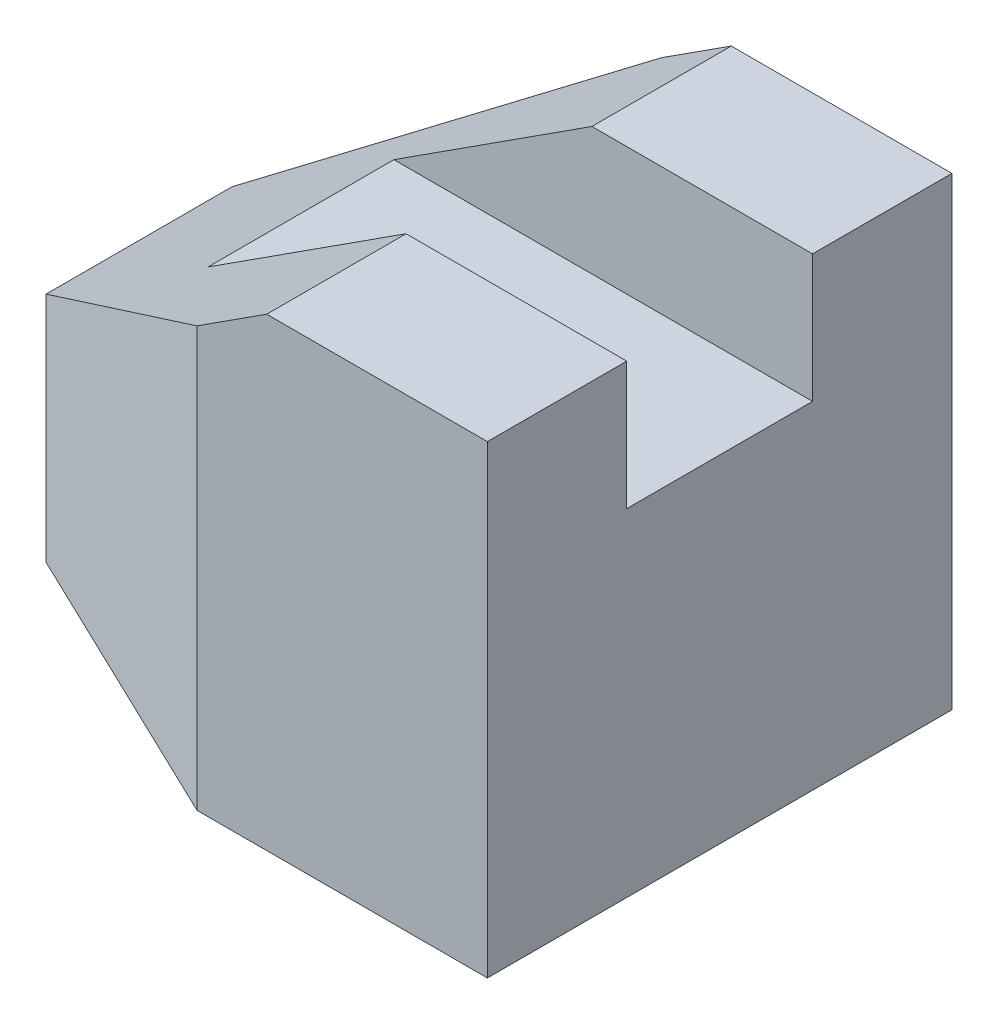
ISO-10303-21;
HEADER;
FILE_DESCRIPTION(('STEP AP214'),'2;1');
FILE_NAME('part.step','',(''),(''),'','','');
FILE_SCHEMA(('AUTOMOTIVE_DESIGN { 1 0 10303 214 1 1 1 1 }'));
ENDSEC;
DATA;
#1=APPLICATION_CONTEXT('core data for automotive mechanical design processes');
#2=APPLICATION_PROTOCOL_DEFINITION('international standard','automotive_design',2000,#1);
#3=PRODUCT_CONTEXT('',#1,'mechanical');
#4=PRODUCT('Part','Part','',(#3));
#5=PRODUCT_RELATED_PRODUCT_CATEGORY('part','',(#4));
#6=PRODUCT_DEFINITION_FORMATION('','',#4);
#7=PRODUCT_DEFINITION_CONTEXT('part definition',#1,'design');
#8=PRODUCT_DEFINITION('design','',#6,#7);
#9=PRODUCT_DEFINITION_SHAPE('','',#8);
#10=(LENGTH_UNIT() NAMED_UNIT(*) SI_UNIT(.MILLI.,.METRE.));
#11=(NAMED_UNIT(*) PLANE_ANGLE_UNIT() SI_UNIT($,.RADIAN.));
#12=(NAMED_UNIT(*) SI_UNIT($,.STERADIAN.) SOLID_ANGLE_UNIT());
#13=UNCERTAINTY_MEASURE_WITH_UNIT(LENGTH_MEASURE(1.E-05),#10,'distance_accuracy_value','');
#14=(GEOMETRIC_REPRESENTATION_CONTEXT(3) GLOBAL_UNCERTAINTY_ASSIGNED_CONTEXT((#13)) GLOBAL_UNIT_ASSIGNED_CONTEXT((#10,
#11,#12)) REPRESENTATION_CONTEXT('',''));
#15=CARTESIAN_POINT('',(0.,0.,0.));
#16=DIRECTION('',(0.,0.,1.));
#17=DIRECTION('',(1.,0.,0.));
#18=AXIS2_PLACEMENT_3D('',#15,#16,#17);
#19=CARTESIAN_POINT('',(0.,80.,0.));
#20=DIRECTION('',(0.,-1.,0.));
#21=DIRECTION('',(0.,0.,-1.));
#22=AXIS2_PLACEMENT_3D('',#19,#20,#21);
#23=PLANE('',#22);
#24=DIRECTION('',(0.,0.,1.));
#25=VECTOR('',#24,1.);
#26=CARTESIAN_POINT('',(62.,80.,0.));
#27=LINE('',#26,#25);
#28=CARTESIAN_POINT('',(62.,80.,0.));
#29=VERTEX_POINT('',#28);
#30=CARTESIAN_POINT('',(62.,80.,24.));
#31=VERTEX_POINT('',#30);
#32=EDGE_CURVE('E377',#29,#31,#27,.T.);
#33=ORIENTED_EDGE('',*,*,#32,.T.);
#34=DIRECTION('',(1.,0.,0.));
#35=VECTOR('',#34,1.);
#36=CARTESIAN_POINT('',(0.,80.,24.));
#37=LINE('',#36,#35);
#38=CARTESIAN_POINT('',(100.,80.,24.));
#39=VERTEX_POINT('',#38);
#40=EDGE_CURVE('E335',#31,#39,#37,.T.);
#41=ORIENTED_EDGE('',*,*,#40,.T.);
#42=DIRECTION('',(0.,0.,1.));
#43=VECTOR('',#42,1.);
#44=CARTESIAN_POINT('',(100.,80.,0.));
#45=LINE('',#44,#43);
#46=CARTESIAN_POINT('',(100.,80.,0.));
#47=VERTEX_POINT('',#46);
#48=EDGE_CURVE('E372',#47,#39,#45,.T.);
#49=ORIENTED_EDGE('',*,*,#48,.F.);
#50=DIRECTION('',(1.,0.,0.));
#51=VECTOR('',#50,1.);
#52=CARTESIAN_POINT('',(62.,80.,0.));
#53=LINE('',#52,#51);
#54=EDGE_CURVE('E255',#29,#47,#53,.T.);
#55=ORIENTED_EDGE('',*,*,#54,.F.);
#56=EDGE_LOOP('',(#33,#41,#49,#55));
#57=FACE_BOUND('',#56,.T.);
#58=ADVANCED_FACE('F73',(#57),#23,.F.);
#59=CARTESIAN_POINT('',(-18.2218956649522,28.2439382806759,0.));
#60=DIRECTION('',(0.542126869822094,-0.840296648224244,0.));
#61=DIRECTION('',(0.840296648224244,0.542126869822094,0.));
#62=AXIS2_PLACEMENT_3D('',#59,#60,#61);
#63=PLANE('',#62);
#64=DIRECTION('',(0.,0.,-1.));
#65=VECTOR('',#64,1.);
#66=CARTESIAN_POINT('',(27.9,58.,0.));
#67=LINE('',#66,#65);
#68=CARTESIAN_POINT('',(27.9000000000001,58.,56.));
#69=VERTEX_POINT('',#68);
#70=CARTESIAN_POINT('',(27.9,58.,24.));
#71=VERTEX_POINT('',#70);
#72=EDGE_CURVE('E183',#69,#71,#67,.T.);
#73=ORIENTED_EDGE('',*,*,#72,.T.);
#74=DIRECTION('',(0.840296648224244,0.542126869822094,0.));
#75=VECTOR('',#74,1.);
#76=CARTESIAN_POINT('',(-18.2218956649522,28.2439382806759,24.));
#77=LINE('',#76,#75);
#78=EDGE_CURVE('E332',#71,#31,#77,.T.);
#79=ORIENTED_EDGE('',*,*,#78,.T.);
#80=ORIENTED_EDGE('',*,*,#32,.F.);
#81=DIRECTION('',(0.840296648224244,0.542126869822094,0.));
#82=VECTOR('',#81,1.);
#83=CARTESIAN_POINT('',(50.,72.258064516129,0.));
#84=LINE('',#83,#82);
#85=CARTESIAN_POINT('',(50.,72.258064516129,0.));
#86=VERTEX_POINT('',#85);
#87=EDGE_CURVE('E266',#86,#29,#84,.T.);
#88=ORIENTED_EDGE('',*,*,#87,.F.);
#89=DIRECTION('',(0.779294445289168,0.502770609863979,-0.374061333738801));
#90=VECTOR('',#89,1.);
#91=CARTESIAN_POINT('',(0.,40.,24.));
#92=LINE('',#91,#90);
#93=CARTESIAN_POINT('',(0.,40.,24.));
#94=VERTEX_POINT('',#93);
#95=EDGE_CURVE('E270',#94,#86,#92,.T.);
#96=ORIENTED_EDGE('',*,*,#95,.F.);
#97=DIRECTION('',(0.,0.,-1.));
#98=VECTOR('',#97,1.);
#99=CARTESIAN_POINT('',(0.,40.,56.));
#100=LINE('',#99,#98);
#101=CARTESIAN_POINT('',(0.,40.,56.));
#102=VERTEX_POINT('',#101);
#103=EDGE_CURVE('E295',#102,#94,#100,.T.);
#104=ORIENTED_EDGE('',*,*,#103,.F.);
#105=DIRECTION('',(-0.779294445289168,-0.502770609863979,-0.374061333738801));
#106=VECTOR('',#105,1.);
#107=CARTESIAN_POINT('',(50.,72.258064516129,80.));
#108=LINE('',#107,#106);
#109=CARTESIAN_POINT('',(50.,72.258064516129,80.));
#110=VERTEX_POINT('',#109);
#111=EDGE_CURVE('E175',#110,#102,#108,.T.);
#112=ORIENTED_EDGE('',*,*,#111,.F.);
#113=DIRECTION('',(-0.840296648224244,-0.542126869822094,0.));
#114=VECTOR('',#113,1.);
#115=CARTESIAN_POINT('',(62.,80.,80.));
#116=LINE('',#115,#114);
#117=CARTESIAN_POINT('',(62.,80.,80.));
#118=VERTEX_POINT('',#117);
#119=EDGE_CURVE('E381',#118,#110,#116,.T.);
#120=ORIENTED_EDGE('',*,*,#119,.F.);
#121=CARTESIAN_POINT('',(62.,80.,56.));
#122=VERTEX_POINT('',#121);
#123=EDGE_CURVE('E78',#122,#118,#27,.T.);
#124=ORIENTED_EDGE('',*,*,#123,.F.);
#125=DIRECTION('',(-0.840296648224244,-0.542126869822094,0.));
#126=VECTOR('',#125,1.);
#127=CARTESIAN_POINT('',(-18.2218956649522,28.2439382806759,56.));
#128=LINE('',#127,#126);
#129=EDGE_CURVE('E775',#122,#69,#128,.T.);
#130=ORIENTED_EDGE('',*,*,#129,.T.);
#131=EDGE_LOOP('',(#73,#79,#80,#88,#96,#104,#112,#120,#124,#130));
#132=FACE_BOUND('',#131,.T.);
#133=ADVANCED_FACE('F75',(#132),#63,.F.);
#134=CARTESIAN_POINT('',(0.,0.,0.));
#135=DIRECTION('',(0.,-1.,0.));
#136=DIRECTION('',(0.,0.,-1.));
#137=AXIS2_PLACEMENT_3D('',#134,#135,#136);
#138=PLANE('',#137);
#139=DIRECTION('',(0.,0.,-1.));
#140=VECTOR('',#139,1.);
#141=CARTESIAN_POINT('',(0.,0.,56.));
#142=LINE('',#141,#140);
#143=CARTESIAN_POINT('',(0.,0.,56.));
#144=VERTEX_POINT('',#143);
#145=CARTESIAN_POINT('',(0.,0.,24.));
#146=VERTEX_POINT('',#145);
#147=EDGE_CURVE('E375',#144,#146,#142,.T.);
#148=ORIENTED_EDGE('',*,*,#147,.T.);
#149=DIRECTION('',(0.901523057468274,0.,-0.432731067584771));
#150=VECTOR('',#149,1.);
#151=CARTESIAN_POINT('',(0.,0.,24.));
#152=LINE('',#151,#150);
#153=CARTESIAN_POINT('',(50.,0.,0.));
#154=VERTEX_POINT('',#153);
#155=EDGE_CURVE('E456',#146,#154,#152,.T.);
#156=ORIENTED_EDGE('',*,*,#155,.T.);
#157=DIRECTION('',(1.,0.,0.));
#158=VECTOR('',#157,1.);
#159=CARTESIAN_POINT('',(50.,0.,0.));
#160=LINE('',#159,#158);
#161=CARTESIAN_POINT('',(62.,0.,0.));
#162=VERTEX_POINT('',#161);
#163=EDGE_CURVE('E263',#154,#162,#160,.T.);
#164=ORIENTED_EDGE('',*,*,#163,.T.);
#165=DIRECTION('',(1.,0.,0.));
#166=VECTOR('',#165,1.);
#167=CARTESIAN_POINT('',(62.,0.,0.));
#168=LINE('',#167,#166);
#169=CARTESIAN_POINT('',(100.,0.,0.));
#170=VERTEX_POINT('',#169);
#171=EDGE_CURVE('E325',#162,#170,#168,.T.);
#172=ORIENTED_EDGE('',*,*,#171,.T.);
#173=DIRECTION('',(0.,0.,1.));
#174=VECTOR('',#173,1.);
#175=CARTESIAN_POINT('',(100.,0.,0.));
#176=LINE('',#175,#174);
#177=CARTESIAN_POINT('',(100.,0.,80.));
#178=VERTEX_POINT('',#177);
#179=EDGE_CURVE('E312',#170,#178,#176,.T.);
#180=ORIENTED_EDGE('',*,*,#179,.T.);
#181=DIRECTION('',(-1.,0.,0.));
#182=VECTOR('',#181,1.);
#183=CARTESIAN_POINT('',(100.,0.,80.));
#184=LINE('',#183,#182);
#185=CARTESIAN_POINT('',(62.,0.,80.));
#186=VERTEX_POINT('',#185);
#187=EDGE_CURVE('E303',#178,#186,#184,.T.);
#188=ORIENTED_EDGE('',*,*,#187,.T.);
#189=DIRECTION('',(-1.,0.,0.));
#190=VECTOR('',#189,1.);
#191=CARTESIAN_POINT('',(62.,0.,80.));
#192=LINE('',#191,#190);
#193=CARTESIAN_POINT('',(50.,0.,80.));
#194=VERTEX_POINT('',#193);
#195=EDGE_CURVE('E313',#186,#194,#192,.T.);
#196=ORIENTED_EDGE('',*,*,#195,.T.);
#197=DIRECTION('',(-0.901523057468274,0.,-0.432731067584771));
#198=VECTOR('',#197,1.);
#199=CARTESIAN_POINT('',(50.,0.,80.));
#200=LINE('',#199,#198);
#201=EDGE_CURVE('E555',#194,#144,#200,.T.);
#202=ORIENTED_EDGE('',*,*,#201,.T.);
#203=EDGE_LOOP('',(#148,#156,#164,#172,#180,#188,#196,#202));
#204=FACE_BOUND('',#203,.T.);
#205=ADVANCED_FACE('F229',(#204),#138,.T.);
#206=CARTESIAN_POINT('',(0.,0.,0.));
#207=DIRECTION('',(-1.,0.,0.));
#208=DIRECTION('',(0.,0.,1.));
#209=AXIS2_PLACEMENT_3D('',#206,#207,#208);
#210=PLANE('',#209);
#211=CARTESIAN_POINT('',(0.,0.,56.));
#212=DIRECTION('',(0.,1.,0.));
#213=VECTOR('',#212,1.);
#214=LINE('',#211,#213);
#215=EDGE_CURVE('E100',#144,#102,#214,.T.);
#216=ORIENTED_EDGE('',*,*,#215,.T.);
#217=ORIENTED_EDGE('',*,*,#103,.T.);
#218=CARTESIAN_POINT('',(0.,0.,24.));
#219=DIRECTION('',(0.,1.,0.));
#220=VECTOR('',#219,1.);
#221=LINE('',#218,#220);
#222=EDGE_CURVE('E605',#146,#94,#221,.T.);
#223=ORIENTED_EDGE('',*,*,#222,.F.);
#224=ORIENTED_EDGE('',*,*,#147,.F.);
#225=EDGE_LOOP('',(#216,#217,#223,#224));
#226=FACE_BOUND('',#225,.T.);
#227=ADVANCED_FACE('F629',(#226),#210,.T.);
#228=CARTESIAN_POINT('',(9.3628088426528,0.,19.5058517555267));
#229=DIRECTION('',(-0.432731067584771,0.,-0.901523057468274));
#230=DIRECTION('',(-0.901523057468274,0.,0.432731067584771));
#231=AXIS2_PLACEMENT_3D('',#228,#229,#230);
#232=PLANE('',#231);
#233=ORIENTED_EDGE('',*,*,#222,.T.);
#234=ORIENTED_EDGE('',*,*,#95,.T.);
#235=CARTESIAN_POINT('',(50.,0.,0.));
#236=DIRECTION('',(0.,1.,0.));
#237=VECTOR('',#236,1.);
#238=LINE('',#235,#237);
#239=EDGE_CURVE('E394',#154,#86,#238,.T.);
#240=ORIENTED_EDGE('',*,*,#239,.F.);
#241=ORIENTED_EDGE('',*,*,#155,.F.);
#242=EDGE_LOOP('',(#233,#234,#240,#241));
#243=FACE_BOUND('',#242,.T.);
#244=ADVANCED_FACE('F576',(#243),#232,.T.);
#245=CARTESIAN_POINT('',(-21.8465539661899,0.,45.5136540962289));
#246=DIRECTION('',(-0.432731067584771,0.,0.901523057468274));
#247=DIRECTION('',(0.901523057468274,0.,0.432731067584771));
#248=AXIS2_PLACEMENT_3D('',#245,#246,#247);
#249=PLANE('',#248);
#250=CARTESIAN_POINT('',(50.,0.,80.));
#251=DIRECTION('',(0.,1.,0.));
#252=VECTOR('',#251,1.);
#253=LINE('',#250,#252);
#254=EDGE_CURVE('E551',#194,#110,#253,.T.);
#255=ORIENTED_EDGE('',*,*,#254,.T.);
#256=ORIENTED_EDGE('',*,*,#111,.T.);
#257=ORIENTED_EDGE('',*,*,#215,.F.);
#258=ORIENTED_EDGE('',*,*,#201,.F.);
#259=EDGE_LOOP('',(#255,#256,#257,#258));
#260=FACE_BOUND('',#259,.T.);
#261=ADVANCED_FACE('F567',(#260),#249,.T.);
#262=CARTESIAN_POINT('',(0.,0.,80.));
#263=DIRECTION('',(0.,0.,1.));
#264=DIRECTION('',(1.,0.,0.));
#265=AXIS2_PLACEMENT_3D('',#262,#263,#264);
#266=PLANE('',#265);
#267=ORIENTED_EDGE('',*,*,#195,.F.);
#268=ORIENTED_EDGE('',*,*,#187,.F.);
#269=CARTESIAN_POINT('',(100.,0.,80.));
#270=DIRECTION('',(0.,1.,0.));
#271=VECTOR('',#270,1.);
#272=LINE('',#269,#271);
#273=CARTESIAN_POINT('',(100.,80.,80.));
#274=VERTEX_POINT('',#273);
#275=EDGE_CURVE('E311',#178,#274,#272,.T.);
#276=ORIENTED_EDGE('',*,*,#275,.T.);
#277=DIRECTION('',(-1.,0.,0.));
#278=VECTOR('',#277,1.);
#279=CARTESIAN_POINT('',(100.,80.,80.));
#280=LINE('',#279,#278);
#281=EDGE_CURVE('E271',#274,#118,#280,.T.);
#282=ORIENTED_EDGE('',*,*,#281,.T.);
#283=ORIENTED_EDGE('',*,*,#119,.T.);
#284=ORIENTED_EDGE('',*,*,#254,.F.);
#285=EDGE_LOOP('',(#267,#268,#276,#282,#283,#284));
#286=FACE_BOUND('',#285,.T.);
#287=ADVANCED_FACE('F413',(#286),#266,.T.);
#288=CARTESIAN_POINT('',(0.,0.,0.));
#289=DIRECTION('',(0.,0.,-1.));
#290=DIRECTION('',(-1.,0.,0.));
#291=AXIS2_PLACEMENT_3D('',#288,#289,#290);
#292=PLANE('',#291);
#293=ORIENTED_EDGE('',*,*,#239,.T.);
#294=ORIENTED_EDGE('',*,*,#87,.T.);
#295=ORIENTED_EDGE('',*,*,#54,.T.);
#296=CARTESIAN_POINT('',(100.,0.,0.));
#297=DIRECTION('',(0.,1.,0.));
#298=VECTOR('',#297,1.);
#299=LINE('',#296,#298);
#300=EDGE_CURVE('E262',#170,#47,#299,.T.);
#301=ORIENTED_EDGE('',*,*,#300,.F.);
#302=ORIENTED_EDGE('',*,*,#171,.F.);
#303=ORIENTED_EDGE('',*,*,#163,.F.);
#304=EDGE_LOOP('',(#293,#294,#295,#301,#302,#303));
#305=FACE_BOUND('',#304,.T.);
#306=ADVANCED_FACE('F226',(#305),#292,.T.);
#307=CARTESIAN_POINT('',(100.,80.,56.));
#308=VERTEX_POINT('',#307);
#309=EDGE_CURVE('E261',#308,#274,#45,.T.);
#310=ORIENTED_EDGE('',*,*,#309,.F.);
#311=DIRECTION('',(-1.,0.,0.));
#312=VECTOR('',#311,1.);
#313=CARTESIAN_POINT('',(0.,80.,56.));
#314=LINE('',#313,#312);
#315=EDGE_CURVE('E92',#308,#122,#314,.T.);
#316=ORIENTED_EDGE('',*,*,#315,.T.);
#317=ORIENTED_EDGE('',*,*,#123,.T.);
#318=ORIENTED_EDGE('',*,*,#281,.F.);
#319=EDGE_LOOP('',(#310,#316,#317,#318));
#320=FACE_BOUND('',#319,.T.);
#321=ADVANCED_FACE('F216',(#320),#23,.F.);
#322=CARTESIAN_POINT('',(100.,0.,0.));
#323=DIRECTION('',(1.,0.,0.));
#324=DIRECTION('',(0.,0.,-1.));
#325=AXIS2_PLACEMENT_3D('',#322,#323,#324);
#326=PLANE('',#325);
#327=DIRECTION('',(0.,1.,0.));
#328=VECTOR('',#327,1.);
#329=CARTESIAN_POINT('',(100.,0.,24.));
#330=LINE('',#329,#328);
#331=CARTESIAN_POINT('',(100.,58.,24.));
#332=VERTEX_POINT('',#331);
#333=EDGE_CURVE('E12',#332,#39,#330,.T.);
#334=ORIENTED_EDGE('',*,*,#333,.F.);
#335=DIRECTION('',(0.,0.,-1.));
#336=VECTOR('',#335,1.);
#337=CARTESIAN_POINT('',(100.,58.,0.));
#338=LINE('',#337,#336);
#339=CARTESIAN_POINT('',(100.,58.,56.));
#340=VERTEX_POINT('',#339);
#341=EDGE_CURVE('E84',#340,#332,#338,.T.);
#342=ORIENTED_EDGE('',*,*,#341,.F.);
#343=DIRECTION('',(0.,-1.,0.));
#344=VECTOR('',#343,1.);
#345=CARTESIAN_POINT('',(100.,0.,56.));
#346=LINE('',#345,#344);
#347=EDGE_CURVE('E166',#308,#340,#346,.T.);
#348=ORIENTED_EDGE('',*,*,#347,.F.);
#349=ORIENTED_EDGE('',*,*,#309,.T.);
#350=ORIENTED_EDGE('',*,*,#275,.F.);
#351=ORIENTED_EDGE('',*,*,#179,.F.);
#352=ORIENTED_EDGE('',*,*,#300,.T.);
#353=ORIENTED_EDGE('',*,*,#48,.T.);
#354=EDGE_LOOP('',(#334,#342,#348,#349,#350,#351,#352,#353));
#355=FACE_BOUND('',#354,.T.);
#356=ADVANCED_FACE('F188',(#355),#326,.T.);
#357=CARTESIAN_POINT('',(0.,58.,0.));
#358=DIRECTION('',(0.,-1.,0.));
#359=DIRECTION('',(0.,0.,-1.));
#360=AXIS2_PLACEMENT_3D('',#357,#358,#359);
#361=PLANE('',#360);
#362=DIRECTION('',(-1.,0.,0.));
#363=VECTOR('',#362,1.);
#364=CARTESIAN_POINT('',(110.,58.,56.));
#365=LINE('',#364,#363);
#366=EDGE_CURVE('E169',#340,#69,#365,.T.);
#367=ORIENTED_EDGE('',*,*,#366,.F.);
#368=ORIENTED_EDGE('',*,*,#341,.T.);
#369=DIRECTION('',(1.,0.,0.));
#370=VECTOR('',#369,1.);
#371=CARTESIAN_POINT('',(-10.,58.,24.));
#372=LINE('',#371,#370);
#373=EDGE_CURVE('E184',#71,#332,#372,.T.);
#374=ORIENTED_EDGE('',*,*,#373,.F.);
#375=ORIENTED_EDGE('',*,*,#72,.F.);
#376=EDGE_LOOP('',(#367,#368,#374,#375));
#377=FACE_BOUND('',#376,.T.);
#378=ADVANCED_FACE('F179',(#377),#361,.F.);
#379=CARTESIAN_POINT('',(0.,0.,24.));
#380=DIRECTION('',(0.,0.,-1.));
#381=DIRECTION('',(-1.,0.,0.));
#382=AXIS2_PLACEMENT_3D('',#379,#380,#381);
#383=PLANE('',#382);
#384=ORIENTED_EDGE('',*,*,#373,.T.);
#385=ORIENTED_EDGE('',*,*,#333,.T.);
#386=ORIENTED_EDGE('',*,*,#40,.F.);
#387=ORIENTED_EDGE('',*,*,#78,.F.);
#388=EDGE_LOOP('',(#384,#385,#386,#387));
#389=FACE_BOUND('',#388,.T.);
#390=ADVANCED_FACE('F740',(#389),#383,.F.);
#391=CARTESIAN_POINT('',(0.,0.,56.));
#392=DIRECTION('',(0.,0.,1.));
#393=DIRECTION('',(1.,0.,0.));
#394=AXIS2_PLACEMENT_3D('',#391,#392,#393);
#395=PLANE('',#394);
#396=ORIENTED_EDGE('',*,*,#315,.F.);
#397=ORIENTED_EDGE('',*,*,#347,.T.);
#398=ORIENTED_EDGE('',*,*,#366,.T.);
#399=ORIENTED_EDGE('',*,*,#129,.F.);
#400=EDGE_LOOP('',(#396,#397,#398,#399));
#401=FACE_BOUND('',#400,.T.);
#402=ADVANCED_FACE('F168',(#401),#395,.F.);
#403=CLOSED_SHELL('',(#58,#133,#205,#227,#244,#261,#287,#306,#321,#356,#378,#390,#402));
#404=MANIFOLD_SOLID_BREP('B2',#403);
#405=ADVANCED_BREP_SHAPE_REPRESENTATION('',(#18,#404),#14);
#406=SHAPE_DEFINITION_REPRESENTATION(#9,#405);
ENDSEC;
END-ISO-10303-21;
